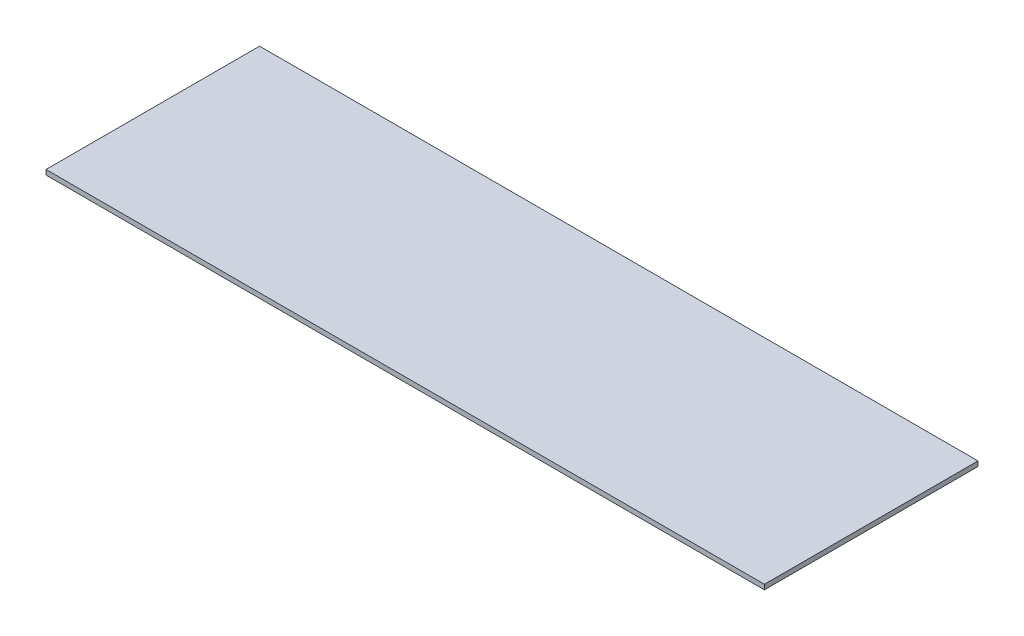
ISO-10303-21;
HEADER;
FILE_DESCRIPTION(('STEP AP214'),'2;1');
FILE_NAME('part.step','',(''),(''),'','','');
FILE_SCHEMA(('AUTOMOTIVE_DESIGN { 1 0 10303 214 1 1 1 1 }'));
ENDSEC;
DATA;
#1=APPLICATION_CONTEXT('core data for automotive mechanical design processes');
#2=APPLICATION_PROTOCOL_DEFINITION('international standard','automotive_design',2000,#1);
#3=PRODUCT_CONTEXT('',#1,'mechanical');
#4=PRODUCT('Part','Part','',(#3));
#5=PRODUCT_RELATED_PRODUCT_CATEGORY('part','',(#4));
#6=PRODUCT_DEFINITION_FORMATION('','',#4);
#7=PRODUCT_DEFINITION_CONTEXT('part definition',#1,'design');
#8=PRODUCT_DEFINITION('design','',#6,#7);
#9=PRODUCT_DEFINITION_SHAPE('','',#8);
#10=(LENGTH_UNIT() NAMED_UNIT(*) SI_UNIT(.MILLI.,.METRE.));
#11=(NAMED_UNIT(*) PLANE_ANGLE_UNIT() SI_UNIT($,.RADIAN.));
#12=(NAMED_UNIT(*) SI_UNIT($,.STERADIAN.) SOLID_ANGLE_UNIT());
#13=UNCERTAINTY_MEASURE_WITH_UNIT(LENGTH_MEASURE(1.E-05),#10,'distance_accuracy_value','');
#14=(GEOMETRIC_REPRESENTATION_CONTEXT(3) GLOBAL_UNCERTAINTY_ASSIGNED_CONTEXT((#13)) GLOBAL_UNIT_ASSIGNED_CONTEXT((#10,
#11,#12)) REPRESENTATION_CONTEXT('',''));
#15=CARTESIAN_POINT('',(0.,0.,0.));
#16=DIRECTION('',(0.,0.,1.));
#17=DIRECTION('',(1.,0.,0.));
#18=AXIS2_PLACEMENT_3D('',#15,#16,#17);
#19=CARTESIAN_POINT('',(117.475,1.5875,34.925));
#20=DIRECTION('',(-1.,0.,0.));
#21=DIRECTION('',(0.,0.,1.));
#22=AXIS2_PLACEMENT_3D('',#19,#20,#21);
#23=PLANE('',#22);
#24=DIRECTION('',(0.,0.,-1.));
#25=VECTOR('',#24,1.);
#26=CARTESIAN_POINT('',(117.475,0.,34.925));
#27=LINE('',#26,#25);
#28=CARTESIAN_POINT('',(117.475,0.,34.925));
#29=VERTEX_POINT('',#28);
#30=CARTESIAN_POINT('',(117.475,0.,-34.925));
#31=VERTEX_POINT('',#30);
#32=EDGE_CURVE('E96',#29,#31,#27,.T.);
#33=ORIENTED_EDGE('',*,*,#32,.T.);
#34=DIRECTION('',(0.,-1.,0.));
#35=VECTOR('',#34,1.);
#36=CARTESIAN_POINT('',(117.475,1.5875,-34.925));
#37=LINE('',#36,#35);
#38=CARTESIAN_POINT('',(117.475,1.5875,-34.925));
#39=VERTEX_POINT('',#38);
#40=EDGE_CURVE('E11',#39,#31,#37,.T.);
#41=ORIENTED_EDGE('',*,*,#40,.F.);
#42=DIRECTION('',(0.,0.,-1.));
#43=VECTOR('',#42,1.);
#44=CARTESIAN_POINT('',(117.475,1.5875,34.925));
#45=LINE('',#44,#43);
#46=CARTESIAN_POINT('',(117.475,1.5875,34.925));
#47=VERTEX_POINT('',#46);
#48=EDGE_CURVE('E84',#47,#39,#45,.T.);
#49=ORIENTED_EDGE('',*,*,#48,.F.);
#50=DIRECTION('',(0.,-1.,0.));
#51=VECTOR('',#50,1.);
#52=CARTESIAN_POINT('',(117.475,1.5875,34.925));
#53=LINE('',#52,#51);
#54=EDGE_CURVE('E92',#47,#29,#53,.T.);
#55=ORIENTED_EDGE('',*,*,#54,.T.);
#56=EDGE_LOOP('',(#33,#41,#49,#55));
#57=FACE_BOUND('',#56,.T.);
#58=ADVANCED_FACE('F33',(#57),#23,.F.);
#59=CARTESIAN_POINT('',(-117.475,1.5875,-34.925));
#60=DIRECTION('',(0.,0.,1.));
#61=DIRECTION('',(1.,0.,0.));
#62=AXIS2_PLACEMENT_3D('',#59,#60,#61);
#63=PLANE('',#62);
#64=DIRECTION('',(-1.,0.,0.));
#65=VECTOR('',#64,1.);
#66=CARTESIAN_POINT('',(-117.475,0.,-34.925));
#67=LINE('',#66,#65);
#68=CARTESIAN_POINT('',(-117.475,0.,-34.925));
#69=VERTEX_POINT('',#68);
#70=EDGE_CURVE('E88',#31,#69,#67,.T.);
#71=ORIENTED_EDGE('',*,*,#70,.T.);
#72=DIRECTION('',(0.,-1.,0.));
#73=VECTOR('',#72,1.);
#74=CARTESIAN_POINT('',(-117.475,1.5875,-34.925));
#75=LINE('',#74,#73);
#76=CARTESIAN_POINT('',(-117.475,1.5875,-34.925));
#77=VERTEX_POINT('',#76);
#78=EDGE_CURVE('E41',#77,#69,#75,.T.);
#79=ORIENTED_EDGE('',*,*,#78,.F.);
#80=DIRECTION('',(-1.,0.,0.));
#81=VECTOR('',#80,1.);
#82=CARTESIAN_POINT('',(-117.475,1.5875,-34.925));
#83=LINE('',#82,#81);
#84=EDGE_CURVE('E79',#39,#77,#83,.T.);
#85=ORIENTED_EDGE('',*,*,#84,.F.);
#86=ORIENTED_EDGE('',*,*,#40,.T.);
#87=EDGE_LOOP('',(#71,#79,#85,#86));
#88=FACE_BOUND('',#87,.T.);
#89=ADVANCED_FACE('F87',(#88),#63,.F.);
#90=CARTESIAN_POINT('',(-117.475,1.5875,34.925));
#91=DIRECTION('',(1.,0.,0.));
#92=DIRECTION('',(0.,0.,-1.));
#93=AXIS2_PLACEMENT_3D('',#90,#91,#92);
#94=PLANE('',#93);
#95=DIRECTION('',(0.,0.,1.));
#96=VECTOR('',#95,1.);
#97=CARTESIAN_POINT('',(-117.475,0.,34.925));
#98=LINE('',#97,#96);
#99=CARTESIAN_POINT('',(-117.475,0.,34.925));
#100=VERTEX_POINT('',#99);
#101=EDGE_CURVE('E66',#69,#100,#98,.T.);
#102=ORIENTED_EDGE('',*,*,#101,.T.);
#103=DIRECTION('',(0.,-1.,0.));
#104=VECTOR('',#103,1.);
#105=CARTESIAN_POINT('',(-117.475,1.5875,34.925));
#106=LINE('',#105,#104);
#107=CARTESIAN_POINT('',(-117.475,1.5875,34.925));
#108=VERTEX_POINT('',#107);
#109=EDGE_CURVE('E89',#108,#100,#106,.T.);
#110=ORIENTED_EDGE('',*,*,#109,.F.);
#111=DIRECTION('',(0.,0.,1.));
#112=VECTOR('',#111,1.);
#113=CARTESIAN_POINT('',(-117.475,1.5875,34.925));
#114=LINE('',#113,#112);
#115=EDGE_CURVE('E82',#77,#108,#114,.T.);
#116=ORIENTED_EDGE('',*,*,#115,.F.);
#117=ORIENTED_EDGE('',*,*,#78,.T.);
#118=EDGE_LOOP('',(#102,#110,#116,#117));
#119=FACE_BOUND('',#118,.T.);
#120=ADVANCED_FACE('F90',(#119),#94,.F.);
#121=CARTESIAN_POINT('',(-117.475,1.5875,34.925));
#122=DIRECTION('',(0.,0.,-1.));
#123=DIRECTION('',(-1.,0.,0.));
#124=AXIS2_PLACEMENT_3D('',#121,#122,#123);
#125=PLANE('',#124);
#126=DIRECTION('',(1.,0.,0.));
#127=VECTOR('',#126,1.);
#128=CARTESIAN_POINT('',(-117.475,0.,34.925));
#129=LINE('',#128,#127);
#130=EDGE_CURVE('E72',#100,#29,#129,.T.);
#131=ORIENTED_EDGE('',*,*,#130,.T.);
#132=ORIENTED_EDGE('',*,*,#54,.F.);
#133=DIRECTION('',(1.,0.,0.));
#134=VECTOR('',#133,1.);
#135=CARTESIAN_POINT('',(-117.475,1.5875,34.925));
#136=LINE('',#135,#134);
#137=EDGE_CURVE('E49',#108,#47,#136,.T.);
#138=ORIENTED_EDGE('',*,*,#137,.F.);
#139=ORIENTED_EDGE('',*,*,#109,.T.);
#140=EDGE_LOOP('',(#131,#132,#138,#139));
#141=FACE_BOUND('',#140,.T.);
#142=ADVANCED_FACE('F103',(#141),#125,.F.);
#143=CARTESIAN_POINT('',(0.,1.5875,0.));
#144=DIRECTION('',(0.,-1.,0.));
#145=DIRECTION('',(0.,0.,-1.));
#146=AXIS2_PLACEMENT_3D('',#143,#144,#145);
#147=PLANE('',#146);
#148=ORIENTED_EDGE('',*,*,#48,.T.);
#149=ORIENTED_EDGE('',*,*,#84,.T.);
#150=ORIENTED_EDGE('',*,*,#115,.T.);
#151=ORIENTED_EDGE('',*,*,#137,.T.);
#152=EDGE_LOOP('',(#148,#149,#150,#151));
#153=FACE_BOUND('',#152,.T.);
#154=ADVANCED_FACE('F80',(#153),#147,.F.);
#155=CARTESIAN_POINT('',(0.,0.,0.));
#156=DIRECTION('',(0.,-1.,0.));
#157=DIRECTION('',(0.,0.,-1.));
#158=AXIS2_PLACEMENT_3D('',#155,#156,#157);
#159=PLANE('',#158);
#160=ORIENTED_EDGE('',*,*,#32,.F.);
#161=ORIENTED_EDGE('',*,*,#130,.F.);
#162=ORIENTED_EDGE('',*,*,#101,.F.);
#163=ORIENTED_EDGE('',*,*,#70,.F.);
#164=EDGE_LOOP('',(#160,#161,#162,#163));
#165=FACE_BOUND('',#164,.T.);
#166=ADVANCED_FACE('F106',(#165),#159,.T.);
#167=CLOSED_SHELL('',(#58,#89,#120,#142,#154,#166));
#168=MANIFOLD_SOLID_BREP('B2',#167);
#169=ADVANCED_BREP_SHAPE_REPRESENTATION('',(#18,#168),#14);
#170=SHAPE_DEFINITION_REPRESENTATION(#9,#169);
ENDSEC;
END-ISO-10303-21;
